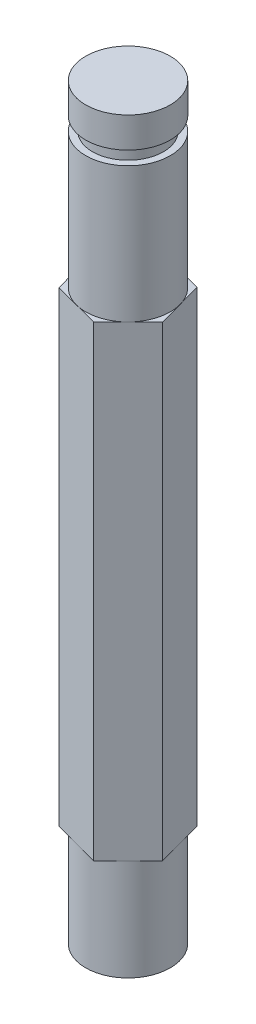
ISO-10303-21;
HEADER;
FILE_DESCRIPTION(('STEP AP214'),'2;1');
FILE_NAME('part.step','',(''),(''),'','','');
FILE_SCHEMA(('AUTOMOTIVE_DESIGN { 1 0 10303 214 1 1 1 1 }'));
ENDSEC;
DATA;
#1=APPLICATION_CONTEXT('core data for automotive mechanical design processes');
#2=APPLICATION_PROTOCOL_DEFINITION('international standard','automotive_design',2000,#1);
#3=PRODUCT_CONTEXT('',#1,'mechanical');
#4=PRODUCT('Part','Part','',(#3));
#5=PRODUCT_RELATED_PRODUCT_CATEGORY('part','',(#4));
#6=PRODUCT_DEFINITION_FORMATION('','',#4);
#7=PRODUCT_DEFINITION_CONTEXT('part definition',#1,'design');
#8=PRODUCT_DEFINITION('design','',#6,#7);
#9=PRODUCT_DEFINITION_SHAPE('','',#8);
#10=(LENGTH_UNIT() NAMED_UNIT(*) SI_UNIT(.MILLI.,.METRE.));
#11=(NAMED_UNIT(*) PLANE_ANGLE_UNIT() SI_UNIT($,.RADIAN.));
#12=(NAMED_UNIT(*) SI_UNIT($,.STERADIAN.) SOLID_ANGLE_UNIT());
#13=UNCERTAINTY_MEASURE_WITH_UNIT(LENGTH_MEASURE(1.E-05),#10,'distance_accuracy_value','');
#14=(GEOMETRIC_REPRESENTATION_CONTEXT(3) GLOBAL_UNCERTAINTY_ASSIGNED_CONTEXT((#13)) GLOBAL_UNIT_ASSIGNED_CONTEXT((#10,
#11,#12)) REPRESENTATION_CONTEXT('',''));
#15=CARTESIAN_POINT('',(0.,0.,0.));
#16=DIRECTION('',(0.,0.,1.));
#17=DIRECTION('',(1.,0.,0.));
#18=AXIS2_PLACEMENT_3D('',#15,#16,#17);
#19=CARTESIAN_POINT('',(0.,0.,0.));
#20=DIRECTION('',(0.,1.,0.));
#21=DIRECTION('',(0.,0.,1.));
#22=AXIS2_PLACEMENT_3D('',#19,#20,#21);
#23=PLANE('',#22);
#24=CARTESIAN_POINT('',(0.,0.,0.));
#25=DIRECTION('',(0.,-1.,0.));
#26=DIRECTION('',(0.,0.,-1.));
#27=AXIS2_PLACEMENT_3D('',#24,#25,#26);
#28=CIRCLE('',#27,3.175);
#29=CARTESIAN_POINT('',(0.814618886699092,0.,-3.06871651825859));
#30=VERTEX_POINT('',#29);
#31=CARTESIAN_POINT('',(3.06489590517442,0.,-0.828877608845288));
#32=VERTEX_POINT('',#31);
#33=EDGE_CURVE('E54',#30,#32,#28,.T.);
#34=ORIENTED_EDGE('',*,*,#33,.F.);
#35=DIRECTION('',(-0.966524887640501,0.,-0.256572877700501));
#36=VECTOR('',#35,1.);
#37=CARTESIAN_POINT('',(2.58634319458234,0.,-2.59839608473592));
#38=LINE('',#37,#36);
#39=CARTESIAN_POINT('',(2.58634319458234,0.,-2.59839608473592));
#40=VERTEX_POINT('',#39);
#41=EDGE_CURVE('E138',#40,#30,#38,.T.);
#42=ORIENTED_EDGE('',*,*,#41,.F.);
#43=DIRECTION('',(-0.261063813809539,0.,-0.965321544936825));
#44=VECTOR('',#43,1.);
#45=CARTESIAN_POINT('',(3.5434486157665,0.,0.940640867045346));
#46=LINE('',#45,#44);
#47=EDGE_CURVE('E155',#32,#40,#46,.T.);
#48=ORIENTED_EDGE('',*,*,#47,.F.);
#49=EDGE_LOOP('',(#34,#42,#48));
#50=FACE_BOUND('',#49,.T.);
#51=ADVANCED_FACE('F43',(#50),#23,.F.);
#52=CARTESIAN_POINT('',(2.25027701847533,0.,2.23983890941331));
#53=VERTEX_POINT('',#52);
#54=EDGE_CURVE('E11',#32,#53,#28,.T.);
#55=ORIENTED_EDGE('',*,*,#54,.F.);
#56=CARTESIAN_POINT('',(3.5434486157665,0.,0.940640867045346));
#57=VERTEX_POINT('',#56);
#58=EDGE_CURVE('E153',#57,#32,#46,.T.);
#59=ORIENTED_EDGE('',*,*,#58,.F.);
#60=DIRECTION('',(0.705461073830963,0.,-0.708748667236324));
#61=VECTOR('',#60,1.);
#62=CARTESIAN_POINT('',(0.957105421184156,0.,3.53903695178127));
#63=LINE('',#62,#61);
#64=EDGE_CURVE('E218',#53,#57,#63,.T.);
#65=ORIENTED_EDGE('',*,*,#64,.F.);
#66=EDGE_LOOP('',(#55,#59,#65));
#67=FACE_BOUND('',#66,.T.);
#68=ADVANCED_FACE('F261',(#67),#23,.F.);
#69=CARTESIAN_POINT('',(-0.814618886699092,0.,3.06871651825859));
#70=VERTEX_POINT('',#69);
#71=EDGE_CURVE('E52',#53,#70,#28,.T.);
#72=ORIENTED_EDGE('',*,*,#71,.F.);
#73=CARTESIAN_POINT('',(0.957105421184156,0.,3.53903695178127));
#74=VERTEX_POINT('',#73);
#75=EDGE_CURVE('E219',#74,#53,#63,.T.);
#76=ORIENTED_EDGE('',*,*,#75,.F.);
#77=DIRECTION('',(0.966524887640501,0.,0.256572877700501));
#78=VECTOR('',#77,1.);
#79=CARTESIAN_POINT('',(-2.58634319458234,0.,2.59839608473592));
#80=LINE('',#79,#78);
#81=EDGE_CURVE('E214',#70,#74,#80,.T.);
#82=ORIENTED_EDGE('',*,*,#81,.F.);
#83=EDGE_LOOP('',(#72,#76,#82));
#84=FACE_BOUND('',#83,.T.);
#85=ADVANCED_FACE('F266',(#84),#23,.F.);
#86=CARTESIAN_POINT('',(-3.06489590517442,0.,0.828877608845287));
#87=VERTEX_POINT('',#86);
#88=EDGE_CURVE('E162',#70,#87,#28,.T.);
#89=ORIENTED_EDGE('',*,*,#88,.F.);
#90=CARTESIAN_POINT('',(-2.58634319458234,0.,2.59839608473592));
#91=VERTEX_POINT('',#90);
#92=EDGE_CURVE('E215',#91,#70,#80,.T.);
#93=ORIENTED_EDGE('',*,*,#92,.F.);
#94=DIRECTION('',(0.261063813809539,0.,0.965321544936825));
#95=VECTOR('',#94,1.);
#96=CARTESIAN_POINT('',(-3.5434486157665,0.,-0.940640867045345));
#97=LINE('',#96,#95);
#98=EDGE_CURVE('E210',#87,#91,#97,.T.);
#99=ORIENTED_EDGE('',*,*,#98,.F.);
#100=EDGE_LOOP('',(#89,#93,#99));
#101=FACE_BOUND('',#100,.T.);
#102=ADVANCED_FACE('F274',(#101),#23,.F.);
#103=CARTESIAN_POINT('',(-2.25027701847533,0.,-2.23983890941331));
#104=VERTEX_POINT('',#103);
#105=EDGE_CURVE('E68',#87,#104,#28,.T.);
#106=ORIENTED_EDGE('',*,*,#105,.F.);
#107=CARTESIAN_POINT('',(-3.5434486157665,0.,-0.940640867045345));
#108=VERTEX_POINT('',#107);
#109=EDGE_CURVE('E211',#108,#87,#97,.T.);
#110=ORIENTED_EDGE('',*,*,#109,.F.);
#111=DIRECTION('',(-0.705461073830962,0.,0.708748667236324));
#112=VECTOR('',#111,1.);
#113=CARTESIAN_POINT('',(-0.957105421184158,0.,-3.53903695178127));
#114=LINE('',#113,#112);
#115=EDGE_CURVE('E148',#104,#108,#114,.T.);
#116=ORIENTED_EDGE('',*,*,#115,.F.);
#117=EDGE_LOOP('',(#106,#110,#116));
#118=FACE_BOUND('',#117,.T.);
#119=ADVANCED_FACE('F279',(#118),#23,.F.);
#120=CARTESIAN_POINT('',(0.,35.052,0.));
#121=DIRECTION('',(0.,1.,0.));
#122=DIRECTION('',(0.,0.,1.));
#123=AXIS2_PLACEMENT_3D('',#120,#121,#122);
#124=PLANE('',#123);
#125=CARTESIAN_POINT('',(0.,35.052,0.));
#126=DIRECTION('',(0.,1.,0.));
#127=DIRECTION('',(0.,0.,1.));
#128=AXIS2_PLACEMENT_3D('',#125,#126,#127);
#129=CIRCLE('',#128,3.175);
#130=CARTESIAN_POINT('',(2.25027701847533,35.052,2.23983890941331));
#131=VERTEX_POINT('',#130);
#132=CARTESIAN_POINT('',(3.06489590517442,35.052,-0.828877608845288));
#133=VERTEX_POINT('',#132);
#134=EDGE_CURVE('E176',#131,#133,#129,.T.);
#135=ORIENTED_EDGE('',*,*,#134,.F.);
#136=DIRECTION('',(0.705461073830963,0.,-0.708748667236324));
#137=VECTOR('',#136,1.);
#138=CARTESIAN_POINT('',(0.957105421184156,35.052,3.53903695178127));
#139=LINE('',#138,#137);
#140=CARTESIAN_POINT('',(3.5434486157665,35.052,0.940640867045346));
#141=VERTEX_POINT('',#140);
#142=EDGE_CURVE('E204',#131,#141,#139,.T.);
#143=ORIENTED_EDGE('',*,*,#142,.T.);
#144=DIRECTION('',(-0.261063813809539,0.,-0.965321544936825));
#145=VECTOR('',#144,1.);
#146=CARTESIAN_POINT('',(3.5434486157665,35.052,0.940640867045346));
#147=LINE('',#146,#145);
#148=EDGE_CURVE('E184',#141,#133,#147,.T.);
#149=ORIENTED_EDGE('',*,*,#148,.T.);
#150=EDGE_LOOP('',(#135,#143,#149));
#151=FACE_BOUND('',#150,.T.);
#152=ADVANCED_FACE('F252',(#151),#124,.T.);
#153=CARTESIAN_POINT('',(0.814618886699091,35.052,-3.06871651825859));
#154=VERTEX_POINT('',#153);
#155=EDGE_CURVE('E164',#133,#154,#129,.T.);
#156=ORIENTED_EDGE('',*,*,#155,.F.);
#157=CARTESIAN_POINT('',(2.58634319458234,35.052,-2.59839608473592));
#158=VERTEX_POINT('',#157);
#159=EDGE_CURVE('E188',#133,#158,#147,.T.);
#160=ORIENTED_EDGE('',*,*,#159,.T.);
#161=DIRECTION('',(-0.966524887640501,0.,-0.256572877700501));
#162=VECTOR('',#161,1.);
#163=CARTESIAN_POINT('',(2.58634319458234,35.052,-2.59839608473592));
#164=LINE('',#163,#162);
#165=EDGE_CURVE('E189',#158,#154,#164,.T.);
#166=ORIENTED_EDGE('',*,*,#165,.T.);
#167=EDGE_LOOP('',(#156,#160,#166));
#168=FACE_BOUND('',#167,.T.);
#169=ADVANCED_FACE('F248',(#168),#124,.T.);
#170=CARTESIAN_POINT('',(-2.25027701847533,35.052,-2.23983890941331));
#171=VERTEX_POINT('',#170);
#172=EDGE_CURVE('E241',#154,#171,#129,.T.);
#173=ORIENTED_EDGE('',*,*,#172,.F.);
#174=CARTESIAN_POINT('',(-0.957105421184158,35.052,-3.53903695178127));
#175=VERTEX_POINT('',#174);
#176=EDGE_CURVE('E187',#154,#175,#164,.T.);
#177=ORIENTED_EDGE('',*,*,#176,.T.);
#178=DIRECTION('',(-0.705461073830962,0.,0.708748667236324));
#179=VECTOR('',#178,1.);
#180=CARTESIAN_POINT('',(-0.957105421184158,35.052,-3.53903695178127));
#181=LINE('',#180,#179);
#182=EDGE_CURVE('E193',#175,#171,#181,.T.);
#183=ORIENTED_EDGE('',*,*,#182,.T.);
#184=EDGE_LOOP('',(#173,#177,#183));
#185=FACE_BOUND('',#184,.T.);
#186=ADVANCED_FACE('F430',(#185),#124,.T.);
#187=CARTESIAN_POINT('',(-3.06489590517442,35.052,0.828877608845287));
#188=VERTEX_POINT('',#187);
#189=EDGE_CURVE('E239',#171,#188,#129,.T.);
#190=ORIENTED_EDGE('',*,*,#189,.F.);
#191=CARTESIAN_POINT('',(-3.5434486157665,35.052,-0.940640867045345));
#192=VERTEX_POINT('',#191);
#193=EDGE_CURVE('E192',#171,#192,#181,.T.);
#194=ORIENTED_EDGE('',*,*,#193,.T.);
#195=DIRECTION('',(0.261063813809539,0.,0.965321544936825));
#196=VECTOR('',#195,1.);
#197=CARTESIAN_POINT('',(-3.5434486157665,35.052,-0.940640867045345));
#198=LINE('',#197,#196);
#199=EDGE_CURVE('E197',#192,#188,#198,.T.);
#200=ORIENTED_EDGE('',*,*,#199,.T.);
#201=EDGE_LOOP('',(#190,#194,#200));
#202=FACE_BOUND('',#201,.T.);
#203=ADVANCED_FACE('F437',(#202),#124,.T.);
#204=CARTESIAN_POINT('',(-0.814618886699092,35.052,3.06871651825859));
#205=VERTEX_POINT('',#204);
#206=EDGE_CURVE('E236',#188,#205,#129,.T.);
#207=ORIENTED_EDGE('',*,*,#206,.F.);
#208=CARTESIAN_POINT('',(-2.58634319458234,35.052,2.59839608473592));
#209=VERTEX_POINT('',#208);
#210=EDGE_CURVE('E196',#188,#209,#198,.T.);
#211=ORIENTED_EDGE('',*,*,#210,.T.);
#212=DIRECTION('',(0.966524887640501,0.,0.256572877700501));
#213=VECTOR('',#212,1.);
#214=CARTESIAN_POINT('',(-2.58634319458234,35.052,2.59839608473592));
#215=LINE('',#214,#213);
#216=EDGE_CURVE('E201',#209,#205,#215,.T.);
#217=ORIENTED_EDGE('',*,*,#216,.T.);
#218=EDGE_LOOP('',(#207,#211,#217));
#219=FACE_BOUND('',#218,.T.);
#220=ADVANCED_FACE('F308',(#219),#124,.T.);
#221=CARTESIAN_POINT('',(3.5434486157665,35.052,0.940640867045346));
#222=DIRECTION('',(-0.965321544936825,0.,0.261063813809539));
#223=DIRECTION('',(0.261063813809539,0.,0.965321544936825));
#224=AXIS2_PLACEMENT_3D('',#221,#222,#223);
#225=PLANE('',#224);
#226=ORIENTED_EDGE('',*,*,#58,.T.);
#227=ORIENTED_EDGE('',*,*,#47,.T.);
#228=DIRECTION('',(0.,-1.,0.));
#229=VECTOR('',#228,1.);
#230=CARTESIAN_POINT('',(2.58634319458234,35.052,-2.59839608473592));
#231=LINE('',#230,#229);
#232=EDGE_CURVE('E47',#158,#40,#231,.T.);
#233=ORIENTED_EDGE('',*,*,#232,.F.);
#234=ORIENTED_EDGE('',*,*,#159,.F.);
#235=ORIENTED_EDGE('',*,*,#148,.F.);
#236=DIRECTION('',(0.,-1.,0.));
#237=VECTOR('',#236,1.);
#238=CARTESIAN_POINT('',(3.5434486157665,35.052,0.940640867045346));
#239=LINE('',#238,#237);
#240=EDGE_CURVE('E207',#141,#57,#239,.T.);
#241=ORIENTED_EDGE('',*,*,#240,.T.);
#242=EDGE_LOOP('',(#226,#227,#233,#234,#235,#241));
#243=FACE_BOUND('',#242,.T.);
#244=ADVANCED_FACE('F45',(#243),#225,.F.);
#245=CARTESIAN_POINT('',(2.58634319458234,35.052,-2.59839608473592));
#246=DIRECTION('',(-0.256572877700501,0.,0.966524887640501));
#247=DIRECTION('',(0.966524887640501,0.,0.256572877700501));
#248=AXIS2_PLACEMENT_3D('',#245,#246,#247);
#249=PLANE('',#248);
#250=ORIENTED_EDGE('',*,*,#41,.T.);
#251=CARTESIAN_POINT('',(-0.957105421184158,0.,-3.53903695178127));
#252=VERTEX_POINT('',#251);
#253=EDGE_CURVE('E141',#30,#252,#38,.T.);
#254=ORIENTED_EDGE('',*,*,#253,.T.);
#255=DIRECTION('',(0.,-1.,0.));
#256=VECTOR('',#255,1.);
#257=CARTESIAN_POINT('',(-0.957105421184158,35.052,-3.53903695178127));
#258=LINE('',#257,#256);
#259=EDGE_CURVE('E232',#175,#252,#258,.T.);
#260=ORIENTED_EDGE('',*,*,#259,.F.);
#261=ORIENTED_EDGE('',*,*,#176,.F.);
#262=ORIENTED_EDGE('',*,*,#165,.F.);
#263=ORIENTED_EDGE('',*,*,#232,.T.);
#264=EDGE_LOOP('',(#250,#254,#260,#261,#262,#263));
#265=FACE_BOUND('',#264,.T.);
#266=ADVANCED_FACE('F139',(#265),#249,.F.);
#267=CARTESIAN_POINT('',(-0.957105421184158,35.052,-3.53903695178127));
#268=DIRECTION('',(0.708748667236324,0.,0.705461073830962));
#269=DIRECTION('',(0.705461073830962,0.,-0.708748667236324));
#270=AXIS2_PLACEMENT_3D('',#267,#268,#269);
#271=PLANE('',#270);
#272=EDGE_CURVE('E152',#252,#104,#114,.T.);
#273=ORIENTED_EDGE('',*,*,#272,.T.);
#274=ORIENTED_EDGE('',*,*,#115,.T.);
#275=DIRECTION('',(0.,-1.,0.));
#276=VECTOR('',#275,1.);
#277=CARTESIAN_POINT('',(-3.5434486157665,35.052,-0.940640867045345));
#278=LINE('',#277,#276);
#279=EDGE_CURVE('E230',#192,#108,#278,.T.);
#280=ORIENTED_EDGE('',*,*,#279,.F.);
#281=ORIENTED_EDGE('',*,*,#193,.F.);
#282=ORIENTED_EDGE('',*,*,#182,.F.);
#283=ORIENTED_EDGE('',*,*,#259,.T.);
#284=EDGE_LOOP('',(#273,#274,#280,#281,#282,#283));
#285=FACE_BOUND('',#284,.T.);
#286=ADVANCED_FACE('F280',(#285),#271,.F.);
#287=CARTESIAN_POINT('',(-3.5434486157665,35.052,-0.940640867045345));
#288=DIRECTION('',(0.965321544936825,0.,-0.261063813809539));
#289=DIRECTION('',(-0.261063813809539,0.,-0.965321544936825));
#290=AXIS2_PLACEMENT_3D('',#287,#288,#289);
#291=PLANE('',#290);
#292=ORIENTED_EDGE('',*,*,#109,.T.);
#293=ORIENTED_EDGE('',*,*,#98,.T.);
#294=DIRECTION('',(0.,-1.,0.));
#295=VECTOR('',#294,1.);
#296=CARTESIAN_POINT('',(-2.58634319458234,35.052,2.59839608473592));
#297=LINE('',#296,#295);
#298=EDGE_CURVE('E227',#209,#91,#297,.T.);
#299=ORIENTED_EDGE('',*,*,#298,.F.);
#300=ORIENTED_EDGE('',*,*,#210,.F.);
#301=ORIENTED_EDGE('',*,*,#199,.F.);
#302=ORIENTED_EDGE('',*,*,#279,.T.);
#303=EDGE_LOOP('',(#292,#293,#299,#300,#301,#302));
#304=FACE_BOUND('',#303,.T.);
#305=ADVANCED_FACE('F276',(#304),#291,.F.);
#306=CARTESIAN_POINT('',(-2.58634319458234,35.052,2.59839608473592));
#307=DIRECTION('',(0.256572877700501,0.,-0.966524887640501));
#308=DIRECTION('',(-0.966524887640501,0.,-0.256572877700501));
#309=AXIS2_PLACEMENT_3D('',#306,#307,#308);
#310=PLANE('',#309);
#311=ORIENTED_EDGE('',*,*,#92,.T.);
#312=ORIENTED_EDGE('',*,*,#81,.T.);
#313=DIRECTION('',(0.,-1.,0.));
#314=VECTOR('',#313,1.);
#315=CARTESIAN_POINT('',(0.957105421184156,35.052,3.53903695178127));
#316=LINE('',#315,#314);
#317=CARTESIAN_POINT('',(0.957105421184156,35.052,3.53903695178127));
#318=VERTEX_POINT('',#317);
#319=EDGE_CURVE('E224',#318,#74,#316,.T.);
#320=ORIENTED_EDGE('',*,*,#319,.F.);
#321=EDGE_CURVE('E200',#205,#318,#215,.T.);
#322=ORIENTED_EDGE('',*,*,#321,.F.);
#323=ORIENTED_EDGE('',*,*,#216,.F.);
#324=ORIENTED_EDGE('',*,*,#298,.T.);
#325=EDGE_LOOP('',(#311,#312,#320,#322,#323,#324));
#326=FACE_BOUND('',#325,.T.);
#327=ADVANCED_FACE('F270',(#326),#310,.F.);
#328=CARTESIAN_POINT('',(0.957105421184156,35.052,3.53903695178127));
#329=DIRECTION('',(-0.708748667236324,0.,-0.705461073830963));
#330=DIRECTION('',(-0.705461073830963,0.,0.708748667236324));
#331=AXIS2_PLACEMENT_3D('',#328,#329,#330);
#332=PLANE('',#331);
#333=ORIENTED_EDGE('',*,*,#75,.T.);
#334=ORIENTED_EDGE('',*,*,#64,.T.);
#335=ORIENTED_EDGE('',*,*,#240,.F.);
#336=ORIENTED_EDGE('',*,*,#142,.F.);
#337=EDGE_CURVE('E205',#318,#131,#139,.T.);
#338=ORIENTED_EDGE('',*,*,#337,.F.);
#339=ORIENTED_EDGE('',*,*,#319,.T.);
#340=EDGE_LOOP('',(#333,#334,#335,#336,#338,#339));
#341=FACE_BOUND('',#340,.T.);
#342=ADVANCED_FACE('F257',(#341),#332,.F.);
#343=EDGE_CURVE('E183',#205,#131,#129,.T.);
#344=ORIENTED_EDGE('',*,*,#343,.F.);
#345=ORIENTED_EDGE('',*,*,#321,.T.);
#346=ORIENTED_EDGE('',*,*,#337,.T.);
#347=EDGE_LOOP('',(#344,#345,#346));
#348=FACE_BOUND('',#347,.T.);
#349=ADVANCED_FACE('F297',(#348),#124,.T.);
#350=EDGE_CURVE('E61',#104,#30,#28,.T.);
#351=ORIENTED_EDGE('',*,*,#350,.F.);
#352=ORIENTED_EDGE('',*,*,#272,.F.);
#353=ORIENTED_EDGE('',*,*,#253,.F.);
#354=EDGE_LOOP('',(#351,#352,#353));
#355=FACE_BOUND('',#354,.T.);
#356=ADVANCED_FACE('F150',(#355),#23,.F.);
#357=CARTESIAN_POINT('',(0.,45.212,0.));
#358=DIRECTION('',(0.,-1.,0.));
#359=DIRECTION('',(0.,0.,-1.));
#360=AXIS2_PLACEMENT_3D('',#357,#358,#359);
#361=CYLINDRICAL_SURFACE('',#360,3.175);
#362=CARTESIAN_POINT('',(0.,45.212,0.));
#363=DIRECTION('',(0.,1.,0.));
#364=DIRECTION('',(0.,0.,1.));
#365=AXIS2_PLACEMENT_3D('',#362,#363,#364);
#366=CIRCLE('',#365,3.175);
#367=CARTESIAN_POINT('',(0.,45.212,3.175));
#368=VERTEX_POINT('',#367);
#369=EDGE_CURVE('E178',#368,#368,#366,.T.);
#370=ORIENTED_EDGE('',*,*,#369,.F.);
#371=EDGE_LOOP('',(#370));
#372=FACE_BOUND('',#371,.T.);
#373=ORIENTED_EDGE('',*,*,#134,.T.);
#374=ORIENTED_EDGE('',*,*,#155,.T.);
#375=ORIENTED_EDGE('',*,*,#172,.T.);
#376=ORIENTED_EDGE('',*,*,#189,.T.);
#377=ORIENTED_EDGE('',*,*,#206,.T.);
#378=ORIENTED_EDGE('',*,*,#343,.T.);
#379=EDGE_LOOP('',(#373,#374,#375,#376,#377,#378));
#380=FACE_BOUND('',#379,.T.);
#381=ADVANCED_FACE('F244',(#372,#380),#361,.T.);
#382=CARTESIAN_POINT('',(0.,45.212,0.));
#383=DIRECTION('',(0.,1.,0.));
#384=DIRECTION('',(0.,0.,1.));
#385=AXIS2_PLACEMENT_3D('',#382,#383,#384);
#386=PLANE('',#385);
#387=CARTESIAN_POINT('',(0.,45.212,0.));
#388=DIRECTION('',(0.,1.,0.));
#389=DIRECTION('',(0.,0.,1.));
#390=AXIS2_PLACEMENT_3D('',#387,#388,#389);
#391=CIRCLE('',#390,2.667);
#392=CARTESIAN_POINT('',(0.,45.212,2.667));
#393=VERTEX_POINT('',#392);
#394=EDGE_CURVE('E161',#393,#393,#391,.T.);
#395=ORIENTED_EDGE('',*,*,#394,.F.);
#396=EDGE_LOOP('',(#395));
#397=FACE_BOUND('',#396,.T.);
#398=ORIENTED_EDGE('',*,*,#369,.T.);
#399=EDGE_LOOP('',(#398));
#400=FACE_BOUND('',#399,.T.);
#401=ADVANCED_FACE('F303',(#397,#400),#386,.T.);
#402=CARTESIAN_POINT('',(0.,46.228,0.));
#403=DIRECTION('',(0.,-1.,0.));
#404=DIRECTION('',(0.,0.,-1.));
#405=AXIS2_PLACEMENT_3D('',#402,#403,#404);
#406=CYLINDRICAL_SURFACE('',#405,2.667);
#407=CARTESIAN_POINT('',(0.,46.228,0.));
#408=DIRECTION('',(0.,1.,0.));
#409=DIRECTION('',(0.,0.,1.));
#410=AXIS2_PLACEMENT_3D('',#407,#408,#409);
#411=CIRCLE('',#410,2.667);
#412=CARTESIAN_POINT('',(0.,46.228,2.667));
#413=VERTEX_POINT('',#412);
#414=EDGE_CURVE('E171',#413,#413,#411,.T.);
#415=ORIENTED_EDGE('',*,*,#414,.F.);
#416=EDGE_LOOP('',(#415));
#417=FACE_BOUND('',#416,.T.);
#418=ORIENTED_EDGE('',*,*,#394,.T.);
#419=EDGE_LOOP('',(#418));
#420=FACE_BOUND('',#419,.T.);
#421=ADVANCED_FACE('F365',(#417,#420),#406,.T.);
#422=CARTESIAN_POINT('',(0.,48.514,0.));
#423=DIRECTION('',(0.,-1.,0.));
#424=DIRECTION('',(0.,0.,-1.));
#425=AXIS2_PLACEMENT_3D('',#422,#423,#424);
#426=CYLINDRICAL_SURFACE('',#425,3.175);
#427=CARTESIAN_POINT('',(0.,48.514,0.));
#428=DIRECTION('',(0.,1.,0.));
#429=DIRECTION('',(0.,0.,1.));
#430=AXIS2_PLACEMENT_3D('',#427,#428,#429);
#431=CIRCLE('',#430,3.175);
#432=CARTESIAN_POINT('',(0.,48.514,3.175));
#433=VERTEX_POINT('',#432);
#434=EDGE_CURVE('E168',#433,#433,#431,.T.);
#435=ORIENTED_EDGE('',*,*,#434,.F.);
#436=EDGE_LOOP('',(#435));
#437=FACE_BOUND('',#436,.T.);
#438=CARTESIAN_POINT('',(0.,46.228,0.));
#439=DIRECTION('',(0.,1.,0.));
#440=DIRECTION('',(0.,0.,1.));
#441=AXIS2_PLACEMENT_3D('',#438,#439,#440);
#442=CIRCLE('',#441,3.175);
#443=CARTESIAN_POINT('',(0.,46.228,3.175));
#444=VERTEX_POINT('',#443);
#445=EDGE_CURVE('E172',#444,#444,#442,.T.);
#446=ORIENTED_EDGE('',*,*,#445,.T.);
#447=EDGE_LOOP('',(#446));
#448=FACE_BOUND('',#447,.T.);
#449=ADVANCED_FACE('F359',(#437,#448),#426,.T.);
#450=CARTESIAN_POINT('',(0.,48.514,0.));
#451=DIRECTION('',(0.,1.,0.));
#452=DIRECTION('',(0.,0.,1.));
#453=AXIS2_PLACEMENT_3D('',#450,#451,#452);
#454=PLANE('',#453);
#455=ORIENTED_EDGE('',*,*,#434,.T.);
#456=EDGE_LOOP('',(#455));
#457=FACE_BOUND('',#456,.T.);
#458=ADVANCED_FACE('F356',(#457),#454,.T.);
#459=CARTESIAN_POINT('',(0.,46.228,0.));
#460=DIRECTION('',(0.,1.,0.));
#461=DIRECTION('',(0.,0.,1.));
#462=AXIS2_PLACEMENT_3D('',#459,#460,#461);
#463=PLANE('',#462);
#464=ORIENTED_EDGE('',*,*,#414,.T.);
#465=EDGE_LOOP('',(#464));
#466=FACE_BOUND('',#465,.T.);
#467=ORIENTED_EDGE('',*,*,#445,.F.);
#468=EDGE_LOOP('',(#467));
#469=FACE_BOUND('',#468,.T.);
#470=ADVANCED_FACE('F341',(#466,#469),#463,.F.);
#471=CARTESIAN_POINT('',(0.,-7.62,0.));
#472=DIRECTION('',(0.,1.,0.));
#473=DIRECTION('',(0.,0.,1.));
#474=AXIS2_PLACEMENT_3D('',#471,#472,#473);
#475=CYLINDRICAL_SURFACE('',#474,3.175);
#476=CARTESIAN_POINT('',(0.,-7.62,0.));
#477=DIRECTION('',(0.,-1.,0.));
#478=DIRECTION('',(0.,0.,-1.));
#479=AXIS2_PLACEMENT_3D('',#476,#477,#478);
#480=CIRCLE('',#479,3.175);
#481=CARTESIAN_POINT('',(0.,-7.62,-3.175));
#482=VERTEX_POINT('',#481);
#483=EDGE_CURVE('E158',#482,#482,#480,.T.);
#484=ORIENTED_EDGE('',*,*,#483,.F.);
#485=EDGE_LOOP('',(#484));
#486=FACE_BOUND('',#485,.T.);
#487=ORIENTED_EDGE('',*,*,#33,.T.);
#488=ORIENTED_EDGE('',*,*,#54,.T.);
#489=ORIENTED_EDGE('',*,*,#71,.T.);
#490=ORIENTED_EDGE('',*,*,#88,.T.);
#491=ORIENTED_EDGE('',*,*,#105,.T.);
#492=ORIENTED_EDGE('',*,*,#350,.T.);
#493=EDGE_LOOP('',(#487,#488,#489,#490,#491,#492));
#494=FACE_BOUND('',#493,.T.);
#495=ADVANCED_FACE('F159',(#486,#494),#475,.T.);
#496=CARTESIAN_POINT('',(0.,-7.62,0.));
#497=DIRECTION('',(0.,-1.,0.));
#498=DIRECTION('',(0.,0.,-1.));
#499=AXIS2_PLACEMENT_3D('',#496,#497,#498);
#500=PLANE('',#499);
#501=ORIENTED_EDGE('',*,*,#483,.T.);
#502=EDGE_LOOP('',(#501));
#503=FACE_BOUND('',#502,.T.);
#504=ADVANCED_FACE('F340',(#503),#500,.T.);
#505=CLOSED_SHELL('',(#51,#68,#85,#102,#119,#152,#169,#186,#203,#220,#244,#266,#286,#305,#327,
#342,#349,#356,#381,#401,#421,#449,#458,#470,#495,#504));
#506=MANIFOLD_SOLID_BREP('B2',#505);
#507=ADVANCED_BREP_SHAPE_REPRESENTATION('',(#18,#506),#14);
#508=SHAPE_DEFINITION_REPRESENTATION(#9,#507);
ENDSEC;
END-ISO-10303-21;
